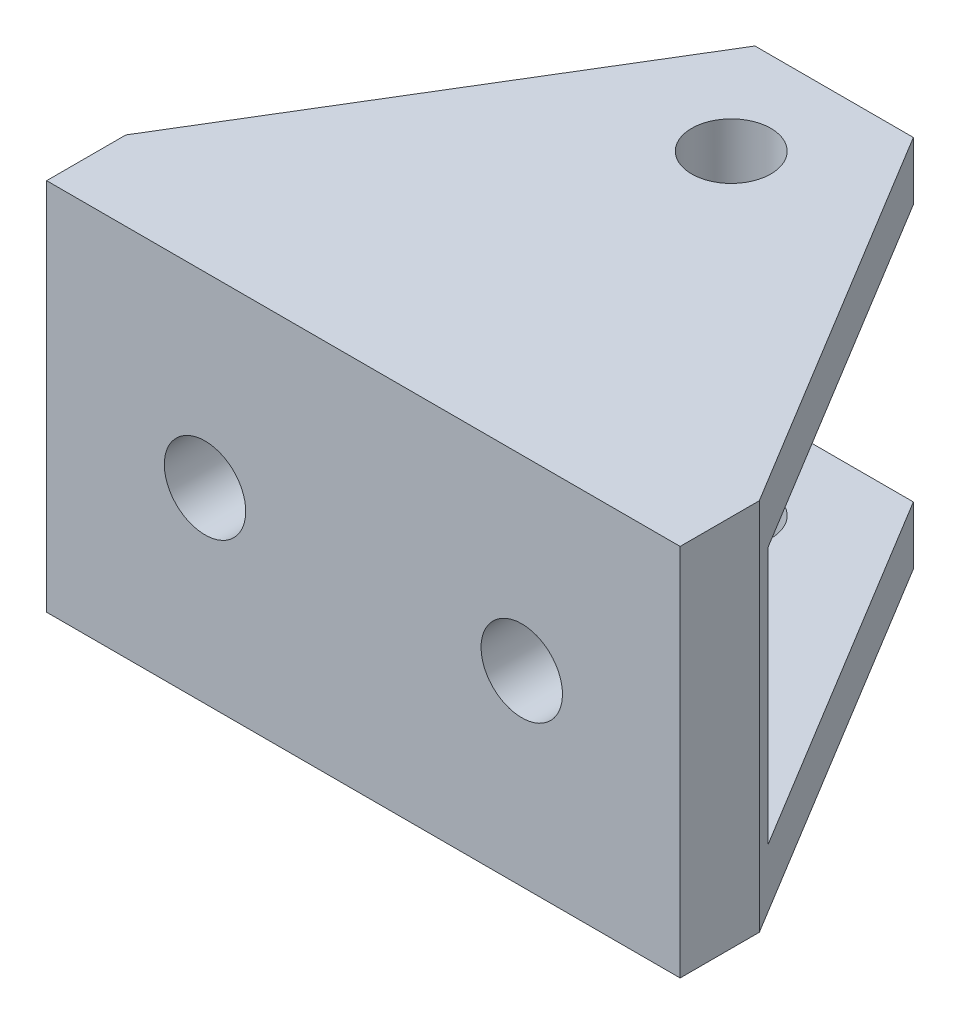
ISO-10303-21;
HEADER;
FILE_DESCRIPTION(('STEP AP214'),'2;1');
FILE_NAME('part.step','',(''),(''),'','','');
FILE_SCHEMA(('AUTOMOTIVE_DESIGN { 1 0 10303 214 1 1 1 1 }'));
ENDSEC;
DATA;
#1=APPLICATION_CONTEXT('core data for automotive mechanical design processes');
#2=APPLICATION_PROTOCOL_DEFINITION('international standard','automotive_design',2000,#1);
#3=PRODUCT_CONTEXT('',#1,'mechanical');
#4=PRODUCT('Part','Part','',(#3));
#5=PRODUCT_RELATED_PRODUCT_CATEGORY('part','',(#4));
#6=PRODUCT_DEFINITION_FORMATION('','',#4);
#7=PRODUCT_DEFINITION_CONTEXT('part definition',#1,'design');
#8=PRODUCT_DEFINITION('design','',#6,#7);
#9=PRODUCT_DEFINITION_SHAPE('','',#8);
#10=(LENGTH_UNIT() NAMED_UNIT(*) SI_UNIT(.MILLI.,.METRE.));
#11=(NAMED_UNIT(*) PLANE_ANGLE_UNIT() SI_UNIT($,.RADIAN.));
#12=(NAMED_UNIT(*) SI_UNIT($,.STERADIAN.) SOLID_ANGLE_UNIT());
#13=UNCERTAINTY_MEASURE_WITH_UNIT(LENGTH_MEASURE(1.E-05),#10,'distance_accuracy_value','');
#14=(GEOMETRIC_REPRESENTATION_CONTEXT(3) GLOBAL_UNCERTAINTY_ASSIGNED_CONTEXT((#13)) GLOBAL_UNIT_ASSIGNED_CONTEXT((#10,
#11,#12)) REPRESENTATION_CONTEXT('',''));
#15=CARTESIAN_POINT('',(0.,0.,0.));
#16=DIRECTION('',(0.,0.,1.));
#17=DIRECTION('',(1.,0.,0.));
#18=AXIS2_PLACEMENT_3D('',#15,#16,#17);
#19=CARTESIAN_POINT('',(50.8,0.,-39.8563150306832));
#20=DIRECTION('',(0.,1.,0.));
#21=DIRECTION('',(0.,0.,1.));
#22=AXIS2_PLACEMENT_3D('',#19,#20,#21);
#23=PLANE('',#22);
#24=CARTESIAN_POINT('',(25.4,0.,-29.4977893685772));
#25=DIRECTION('',(0.,-1.,0.));
#26=DIRECTION('',(0.,0.,-1.));
#27=AXIS2_PLACEMENT_3D('',#24,#25,#26);
#28=CIRCLE('',#27,3.175);
#29=CARTESIAN_POINT('',(25.4,0.,-32.6727893685772));
#30=VERTEX_POINT('',#29);
#31=EDGE_CURVE('E269',#30,#30,#28,.T.);
#32=ORIENTED_EDGE('',*,*,#31,.F.);
#33=EDGE_LOOP('',(#32));
#34=FACE_BOUND('',#33,.T.);
#35=DIRECTION('',(0.,0.,-1.));
#36=VECTOR('',#35,1.);
#37=CARTESIAN_POINT('',(0.,0.,-39.8563150306832));
#38=LINE('',#37,#36);
#39=CARTESIAN_POINT('',(0.,0.,0.));
#40=VERTEX_POINT('',#39);
#41=CARTESIAN_POINT('',(0.,0.,-6.35));
#42=VERTEX_POINT('',#41);
#43=EDGE_CURVE('E149',#40,#42,#38,.T.);
#44=ORIENTED_EDGE('',*,*,#43,.T.);
#45=DIRECTION('',(-0.518660220005768,0.,0.854980453685094));
#46=VECTOR('',#45,1.);
#47=CARTESIAN_POINT('',(0.,0.,-6.35));
#48=LINE('',#47,#46);
#49=CARTESIAN_POINT('',(19.05,0.,-37.7527893685772));
#50=VERTEX_POINT('',#49);
#51=EDGE_CURVE('E70',#50,#42,#48,.T.);
#52=ORIENTED_EDGE('',*,*,#51,.F.);
#53=DIRECTION('',(-1.,0.,0.));
#54=VECTOR('',#53,1.);
#55=CARTESIAN_POINT('',(19.05,0.,-37.7527893685772));
#56=LINE('',#55,#54);
#57=CARTESIAN_POINT('',(31.75,0.,-37.7527893685772));
#58=VERTEX_POINT('',#57);
#59=EDGE_CURVE('E266',#58,#50,#56,.T.);
#60=ORIENTED_EDGE('',*,*,#59,.F.);
#61=DIRECTION('',(-0.518660220005768,0.,-0.854980453685094));
#62=VECTOR('',#61,1.);
#63=CARTESIAN_POINT('',(50.8,0.,-6.35));
#64=LINE('',#63,#62);
#65=CARTESIAN_POINT('',(50.8,0.,-6.35));
#66=VERTEX_POINT('',#65);
#67=EDGE_CURVE('E264',#66,#58,#64,.T.);
#68=ORIENTED_EDGE('',*,*,#67,.F.);
#69=DIRECTION('',(0.,0.,-1.));
#70=VECTOR('',#69,1.);
#71=CARTESIAN_POINT('',(50.8,0.,-39.8563150306832));
#72=LINE('',#71,#70);
#73=CARTESIAN_POINT('',(50.8,0.,0.));
#74=VERTEX_POINT('',#73);
#75=EDGE_CURVE('E153',#74,#66,#72,.T.);
#76=ORIENTED_EDGE('',*,*,#75,.F.);
#77=DIRECTION('',(-1.,0.,0.));
#78=VECTOR('',#77,1.);
#79=CARTESIAN_POINT('',(50.8,0.,0.));
#80=LINE('',#79,#78);
#81=EDGE_CURVE('E159',#74,#40,#80,.T.);
#82=ORIENTED_EDGE('',*,*,#81,.T.);
#83=EDGE_LOOP('',(#44,#52,#60,#68,#76,#82));
#84=FACE_BOUND('',#83,.T.);
#85=ADVANCED_FACE('F47',(#34,#84),#23,.F.);
#86=CARTESIAN_POINT('',(50.8,4.6609,-8.10631503068315));
#87=DIRECTION('',(0.,-1.,0.));
#88=DIRECTION('',(0.,0.,-1.));
#89=AXIS2_PLACEMENT_3D('',#86,#87,#88);
#90=PLANE('',#89);
#91=CARTESIAN_POINT('',(25.4,4.6609,-29.4977893685772));
#92=DIRECTION('',(0.,-1.,0.));
#93=DIRECTION('',(0.,0.,-1.));
#94=AXIS2_PLACEMENT_3D('',#91,#92,#93);
#95=CIRCLE('',#94,3.175);
#96=CARTESIAN_POINT('',(25.4,4.6609,-32.6727893685772));
#97=VERTEX_POINT('',#96);
#98=EDGE_CURVE('E203',#97,#97,#95,.T.);
#99=ORIENTED_EDGE('',*,*,#98,.T.);
#100=EDGE_LOOP('',(#99));
#101=FACE_BOUND('',#100,.T.);
#102=DIRECTION('',(-1.,0.,0.));
#103=VECTOR('',#102,1.);
#104=CARTESIAN_POINT('',(50.8,4.6609,-37.7527893685772));
#105=LINE('',#104,#103);
#106=CARTESIAN_POINT('',(31.75,4.6609,-37.7527893685772));
#107=VERTEX_POINT('',#106);
#108=CARTESIAN_POINT('',(19.05,4.6609,-37.7527893685772));
#109=VERTEX_POINT('',#108);
#110=EDGE_CURVE('E210',#107,#109,#105,.T.);
#111=ORIENTED_EDGE('',*,*,#110,.T.);
#112=DIRECTION('',(-0.518660220005768,0.,0.854980453685094));
#113=VECTOR('',#112,1.);
#114=CARTESIAN_POINT('',(14.4444559074182,4.6609,-30.1608244831682));
#115=LINE('',#114,#113);
#116=CARTESIAN_POINT('',(1.0654404276581,4.66090000000001,-8.10631503068315));
#117=VERTEX_POINT('',#116);
#118=EDGE_CURVE('E182',#109,#117,#115,.T.);
#119=ORIENTED_EDGE('',*,*,#118,.T.);
#120=DIRECTION('',(-1.,0.,0.));
#121=VECTOR('',#120,1.);
#122=CARTESIAN_POINT('',(50.8,4.6609,-8.10631503068315));
#123=LINE('',#122,#121);
#124=CARTESIAN_POINT('',(49.7345595723419,4.6609,-8.10631503068315));
#125=VERTEX_POINT('',#124);
#126=EDGE_CURVE('E11',#125,#117,#123,.T.);
#127=ORIENTED_EDGE('',*,*,#126,.F.);
#128=DIRECTION('',(-0.518660220005768,0.,-0.854980453685094));
#129=VECTOR('',#128,1.);
#130=CARTESIAN_POINT('',(50.0211720224565,4.6609,-7.63385149255397));
#131=LINE('',#130,#129);
#132=EDGE_CURVE('E195',#125,#107,#131,.T.);
#133=ORIENTED_EDGE('',*,*,#132,.T.);
#134=EDGE_LOOP('',(#111,#119,#127,#133));
#135=FACE_BOUND('',#134,.T.);
#136=ADVANCED_FACE('F300',(#101,#135),#90,.F.);
#137=CARTESIAN_POINT('',(50.8,25.3111,-8.10631503068315));
#138=DIRECTION('',(0.,0.,1.));
#139=DIRECTION('',(0.,-1.,0.));
#140=AXIS2_PLACEMENT_3D('',#137,#138,#139);
#141=PLANE('',#140);
#142=CARTESIAN_POINT('',(38.1,14.986,-8.10631503068315));
#143=DIRECTION('',(0.,0.,-1.));
#144=DIRECTION('',(0.,1.,0.));
#145=AXIS2_PLACEMENT_3D('',#142,#143,#144);
#146=CIRCLE('',#145,7.14374999999999);
#147=CARTESIAN_POINT('',(38.1,22.12975,-8.10631503068315));
#148=VERTEX_POINT('',#147);
#149=EDGE_CURVE('E214',#148,#148,#146,.T.);
#150=ORIENTED_EDGE('',*,*,#149,.F.);
#151=EDGE_LOOP('',(#150));
#152=FACE_BOUND('',#151,.T.);
#153=CARTESIAN_POINT('',(12.7,14.986,-8.10631503068315));
#154=DIRECTION('',(0.,0.,-1.));
#155=DIRECTION('',(0.,1.,0.));
#156=AXIS2_PLACEMENT_3D('',#153,#154,#155);
#157=CIRCLE('',#156,7.14374999999999);
#158=CARTESIAN_POINT('',(12.7,22.12975,-8.10631503068315));
#159=VERTEX_POINT('',#158);
#160=EDGE_CURVE('E230',#159,#159,#157,.T.);
#161=ORIENTED_EDGE('',*,*,#160,.F.);
#162=EDGE_LOOP('',(#161));
#163=FACE_BOUND('',#162,.T.);
#164=ORIENTED_EDGE('',*,*,#126,.T.);
#165=DIRECTION('',(0.,1.,0.));
#166=VECTOR('',#165,1.);
#167=CARTESIAN_POINT('',(1.0654404276581,25.3111,-8.10631503068315));
#168=LINE('',#167,#166);
#169=CARTESIAN_POINT('',(1.06544042765809,25.3111,-8.10631503068315));
#170=VERTEX_POINT('',#169);
#171=EDGE_CURVE('E179',#117,#170,#168,.T.);
#172=ORIENTED_EDGE('',*,*,#171,.T.);
#173=DIRECTION('',(-1.,0.,0.));
#174=VECTOR('',#173,1.);
#175=CARTESIAN_POINT('',(50.8,25.3111,-8.10631503068315));
#176=LINE('',#175,#174);
#177=CARTESIAN_POINT('',(49.7345595723419,25.3111,-8.10631503068315));
#178=VERTEX_POINT('',#177);
#179=EDGE_CURVE('E55',#178,#170,#176,.T.);
#180=ORIENTED_EDGE('',*,*,#179,.F.);
#181=DIRECTION('',(0.,-1.,0.));
#182=VECTOR('',#181,1.);
#183=CARTESIAN_POINT('',(49.7345595723419,25.3111,-8.10631503068315));
#184=LINE('',#183,#182);
#185=EDGE_CURVE('E62',#178,#125,#184,.T.);
#186=ORIENTED_EDGE('',*,*,#185,.T.);
#187=EDGE_LOOP('',(#164,#172,#180,#186));
#188=FACE_BOUND('',#187,.T.);
#189=ADVANCED_FACE('F177',(#152,#163,#188),#141,.F.);
#190=CARTESIAN_POINT('',(50.8,25.3111,-39.8563150306832));
#191=DIRECTION('',(0.,1.,0.));
#192=DIRECTION('',(0.,0.,1.));
#193=AXIS2_PLACEMENT_3D('',#190,#191,#192);
#194=PLANE('',#193);
#195=CARTESIAN_POINT('',(25.4,25.3111,-29.4977893685772));
#196=DIRECTION('',(0.,1.,0.));
#197=DIRECTION('',(0.,0.,1.));
#198=AXIS2_PLACEMENT_3D('',#195,#196,#197);
#199=CIRCLE('',#198,3.175);
#200=CARTESIAN_POINT('',(25.4,25.3111,-26.3227893685772));
#201=VERTEX_POINT('',#200);
#202=EDGE_CURVE('E199',#201,#201,#199,.T.);
#203=ORIENTED_EDGE('',*,*,#202,.T.);
#204=EDGE_LOOP('',(#203));
#205=FACE_BOUND('',#204,.T.);
#206=ORIENTED_EDGE('',*,*,#179,.T.);
#207=DIRECTION('',(0.518660220005768,0.,-0.854980453685094));
#208=VECTOR('',#207,1.);
#209=CARTESIAN_POINT('',(28.5238140265521,25.3111,-53.3698070269965));
#210=LINE('',#209,#208);
#211=CARTESIAN_POINT('',(19.05,25.3111,-37.7527893685772));
#212=VERTEX_POINT('',#211);
#213=EDGE_CURVE('E173',#170,#212,#210,.T.);
#214=ORIENTED_EDGE('',*,*,#213,.T.);
#215=DIRECTION('',(1.,0.,0.));
#216=VECTOR('',#215,1.);
#217=CARTESIAN_POINT('',(50.8,25.3111,-37.7527893685772));
#218=LINE('',#217,#216);
#219=CARTESIAN_POINT('',(31.75,25.3111,-37.7527893685772));
#220=VERTEX_POINT('',#219);
#221=EDGE_CURVE('E207',#212,#220,#218,.T.);
#222=ORIENTED_EDGE('',*,*,#221,.T.);
#223=DIRECTION('',(0.518660220005768,0.,0.854980453685094));
#224=VECTOR('',#223,1.);
#225=CARTESIAN_POINT('',(35.9418139033226,25.3111,-30.8428340363823));
#226=LINE('',#225,#224);
#227=EDGE_CURVE('E174',#220,#178,#226,.T.);
#228=ORIENTED_EDGE('',*,*,#227,.T.);
#229=EDGE_LOOP('',(#206,#214,#222,#228));
#230=FACE_BOUND('',#229,.T.);
#231=ADVANCED_FACE('F171',(#205,#230),#194,.F.);
#232=CARTESIAN_POINT('',(50.8,29.972,0.));
#233=DIRECTION('',(0.,-1.,0.));
#234=DIRECTION('',(0.,0.,-1.));
#235=AXIS2_PLACEMENT_3D('',#232,#233,#234);
#236=PLANE('',#235);
#237=CARTESIAN_POINT('',(25.4,29.972,-29.4977893685772));
#238=DIRECTION('',(0.,-1.,0.));
#239=DIRECTION('',(0.,0.,-1.));
#240=AXIS2_PLACEMENT_3D('',#237,#238,#239);
#241=CIRCLE('',#240,3.175);
#242=CARTESIAN_POINT('',(25.4,29.972,-32.6727893685772));
#243=VERTEX_POINT('',#242);
#244=EDGE_CURVE('E187',#243,#243,#241,.F.);
#245=ORIENTED_EDGE('',*,*,#244,.F.);
#246=EDGE_LOOP('',(#245));
#247=FACE_BOUND('',#246,.T.);
#248=DIRECTION('',(1.,0.,0.));
#249=VECTOR('',#248,1.);
#250=CARTESIAN_POINT('',(19.05,29.972,-37.7527893685772));
#251=LINE('',#250,#249);
#252=CARTESIAN_POINT('',(19.05,29.972,-37.7527893685772));
#253=VERTEX_POINT('',#252);
#254=CARTESIAN_POINT('',(31.75,29.972,-37.7527893685772));
#255=VERTEX_POINT('',#254);
#256=EDGE_CURVE('E142',#253,#255,#251,.T.);
#257=ORIENTED_EDGE('',*,*,#256,.F.);
#258=DIRECTION('',(0.518660220005768,0.,-0.854980453685094));
#259=VECTOR('',#258,1.);
#260=CARTESIAN_POINT('',(0.,29.972,-6.35));
#261=LINE('',#260,#259);
#262=CARTESIAN_POINT('',(0.,29.972,-6.35));
#263=VERTEX_POINT('',#262);
#264=EDGE_CURVE('E125',#263,#253,#261,.T.);
#265=ORIENTED_EDGE('',*,*,#264,.F.);
#266=DIRECTION('',(0.,0.,1.));
#267=VECTOR('',#266,1.);
#268=CARTESIAN_POINT('',(0.,29.972,0.));
#269=LINE('',#268,#267);
#270=CARTESIAN_POINT('',(0.,29.972,0.));
#271=VERTEX_POINT('',#270);
#272=EDGE_CURVE('E139',#263,#271,#269,.T.);
#273=ORIENTED_EDGE('',*,*,#272,.T.);
#274=DIRECTION('',(-1.,0.,0.));
#275=VECTOR('',#274,1.);
#276=CARTESIAN_POINT('',(50.8,29.972,0.));
#277=LINE('',#276,#275);
#278=CARTESIAN_POINT('',(50.8,29.972,0.));
#279=VERTEX_POINT('',#278);
#280=EDGE_CURVE('E163',#279,#271,#277,.T.);
#281=ORIENTED_EDGE('',*,*,#280,.F.);
#282=DIRECTION('',(0.,0.,1.));
#283=VECTOR('',#282,1.);
#284=CARTESIAN_POINT('',(50.8,29.972,0.));
#285=LINE('',#284,#283);
#286=CARTESIAN_POINT('',(50.8,29.972,-6.35000000000001));
#287=VERTEX_POINT('',#286);
#288=EDGE_CURVE('E248',#287,#279,#285,.T.);
#289=ORIENTED_EDGE('',*,*,#288,.F.);
#290=DIRECTION('',(0.518660220005768,0.,0.854980453685094));
#291=VECTOR('',#290,1.);
#292=CARTESIAN_POINT('',(50.8,29.972,-6.35));
#293=LINE('',#292,#291);
#294=EDGE_CURVE('E133',#255,#287,#293,.T.);
#295=ORIENTED_EDGE('',*,*,#294,.F.);
#296=EDGE_LOOP('',(#257,#265,#273,#281,#289,#295));
#297=FACE_BOUND('',#296,.T.);
#298=ADVANCED_FACE('F137',(#247,#297),#236,.F.);
#299=CARTESIAN_POINT('',(50.8,0.,0.));
#300=DIRECTION('',(0.,0.,-1.));
#301=DIRECTION('',(-1.,0.,0.));
#302=AXIS2_PLACEMENT_3D('',#299,#300,#301);
#303=PLANE('',#302);
#304=CARTESIAN_POINT('',(38.1,14.986,0.));
#305=DIRECTION('',(0.,0.,-1.));
#306=DIRECTION('',(0.,1.,0.));
#307=AXIS2_PLACEMENT_3D('',#304,#305,#306);
#308=CIRCLE('',#307,3.2639);
#309=CARTESIAN_POINT('',(38.1,18.2499,0.));
#310=VERTEX_POINT('',#309);
#311=EDGE_CURVE('E226',#310,#310,#308,.T.);
#312=ORIENTED_EDGE('',*,*,#311,.T.);
#313=EDGE_LOOP('',(#312));
#314=FACE_BOUND('',#313,.T.);
#315=CARTESIAN_POINT('',(12.7,14.986,0.));
#316=DIRECTION('',(0.,0.,-1.));
#317=DIRECTION('',(0.,1.,0.));
#318=AXIS2_PLACEMENT_3D('',#315,#316,#317);
#319=CIRCLE('',#318,3.2639);
#320=CARTESIAN_POINT('',(12.7,18.2499,0.));
#321=VERTEX_POINT('',#320);
#322=EDGE_CURVE('E155',#321,#321,#319,.T.);
#323=ORIENTED_EDGE('',*,*,#322,.T.);
#324=EDGE_LOOP('',(#323));
#325=FACE_BOUND('',#324,.T.);
#326=DIRECTION('',(0.,-1.,0.));
#327=VECTOR('',#326,1.);
#328=CARTESIAN_POINT('',(0.,0.,0.));
#329=LINE('',#328,#327);
#330=EDGE_CURVE('E147',#271,#40,#329,.T.);
#331=ORIENTED_EDGE('',*,*,#330,.T.);
#332=ORIENTED_EDGE('',*,*,#81,.F.);
#333=DIRECTION('',(0.,-1.,0.));
#334=VECTOR('',#333,1.);
#335=CARTESIAN_POINT('',(50.8,0.,0.));
#336=LINE('',#335,#334);
#337=EDGE_CURVE('E164',#279,#74,#336,.T.);
#338=ORIENTED_EDGE('',*,*,#337,.F.);
#339=ORIENTED_EDGE('',*,*,#280,.T.);
#340=EDGE_LOOP('',(#331,#332,#338,#339));
#341=FACE_BOUND('',#340,.T.);
#342=ADVANCED_FACE('F259',(#314,#325,#341),#303,.F.);
#343=CARTESIAN_POINT('',(50.8,0.,0.));
#344=DIRECTION('',(-1.,0.,0.));
#345=DIRECTION('',(0.,0.,1.));
#346=AXIS2_PLACEMENT_3D('',#343,#344,#345);
#347=PLANE('',#346);
#348=ORIENTED_EDGE('',*,*,#75,.T.);
#349=DIRECTION('',(0.,-1.,0.));
#350=VECTOR('',#349,1.);
#351=CARTESIAN_POINT('',(50.8,90.8268531091431,-6.35));
#352=LINE('',#351,#350);
#353=EDGE_CURVE('E327',#287,#66,#352,.T.);
#354=ORIENTED_EDGE('',*,*,#353,.F.);
#355=ORIENTED_EDGE('',*,*,#288,.T.);
#356=ORIENTED_EDGE('',*,*,#337,.T.);
#357=EDGE_LOOP('',(#348,#354,#355,#356));
#358=FACE_BOUND('',#357,.T.);
#359=ADVANCED_FACE('F254',(#358),#347,.F.);
#360=CARTESIAN_POINT('',(0.,0.,0.));
#361=DIRECTION('',(-1.,0.,0.));
#362=DIRECTION('',(0.,0.,1.));
#363=AXIS2_PLACEMENT_3D('',#360,#361,#362);
#364=PLANE('',#363);
#365=DIRECTION('',(0.,-1.,0.));
#366=VECTOR('',#365,1.);
#367=CARTESIAN_POINT('',(0.,90.8268531091431,-6.35));
#368=LINE('',#367,#366);
#369=EDGE_CURVE('E121',#263,#42,#368,.T.);
#370=ORIENTED_EDGE('',*,*,#369,.T.);
#371=ORIENTED_EDGE('',*,*,#43,.F.);
#372=ORIENTED_EDGE('',*,*,#330,.F.);
#373=ORIENTED_EDGE('',*,*,#272,.F.);
#374=EDGE_LOOP('',(#370,#371,#372,#373));
#375=FACE_BOUND('',#374,.T.);
#376=ADVANCED_FACE('F146',(#375),#364,.T.);
#377=CARTESIAN_POINT('',(12.7,14.986,-8.10631503068315));
#378=DIRECTION('',(0.,0.,-1.));
#379=DIRECTION('',(0.,1.,0.));
#380=AXIS2_PLACEMENT_3D('',#377,#378,#379);
#381=CYLINDRICAL_SURFACE('',#380,3.2639);
#382=ORIENTED_EDGE('',*,*,#322,.F.);
#383=EDGE_LOOP('',(#382));
#384=FACE_BOUND('',#383,.T.);
#385=CARTESIAN_POINT('',(12.7,14.986,-4.80431503068315));
#386=DIRECTION('',(0.,0.,-1.));
#387=DIRECTION('',(0.,1.,0.));
#388=AXIS2_PLACEMENT_3D('',#385,#386,#387);
#389=CIRCLE('',#388,3.26390000000001);
#390=CARTESIAN_POINT('',(12.7,18.2499,-4.80431503068315));
#391=VERTEX_POINT('',#390);
#392=EDGE_CURVE('E238',#391,#391,#389,.T.);
#393=ORIENTED_EDGE('',*,*,#392,.T.);
#394=EDGE_LOOP('',(#393));
#395=FACE_BOUND('',#394,.T.);
#396=ADVANCED_FACE('F363',(#384,#395),#381,.F.);
#397=CARTESIAN_POINT('',(15.9639,14.986,-4.80431503068315));
#398=DIRECTION('',(0.,0.,1.));
#399=DIRECTION('',(0.,-1.,0.));
#400=AXIS2_PLACEMENT_3D('',#397,#398,#399);
#401=PLANE('',#400);
#402=ORIENTED_EDGE('',*,*,#392,.F.);
#403=EDGE_LOOP('',(#402));
#404=FACE_BOUND('',#403,.T.);
#405=CARTESIAN_POINT('',(12.7,14.986,-4.80431503068315));
#406=DIRECTION('',(0.,0.,-1.));
#407=DIRECTION('',(0.,1.,0.));
#408=AXIS2_PLACEMENT_3D('',#405,#406,#407);
#409=CIRCLE('',#408,7.14374999999999);
#410=CARTESIAN_POINT('',(12.7,22.12975,-4.80431503068315));
#411=VERTEX_POINT('',#410);
#412=EDGE_CURVE('E234',#411,#411,#409,.T.);
#413=ORIENTED_EDGE('',*,*,#412,.T.);
#414=EDGE_LOOP('',(#413));
#415=FACE_BOUND('',#414,.T.);
#416=ADVANCED_FACE('F359',(#404,#415),#401,.F.);
#417=CARTESIAN_POINT('',(12.7,14.986,-8.10631503068315));
#418=DIRECTION('',(0.,0.,-1.));
#419=DIRECTION('',(0.,1.,0.));
#420=AXIS2_PLACEMENT_3D('',#417,#418,#419);
#421=CYLINDRICAL_SURFACE('',#420,7.14374999999999);
#422=ORIENTED_EDGE('',*,*,#412,.F.);
#423=EDGE_LOOP('',(#422));
#424=FACE_BOUND('',#423,.T.);
#425=ORIENTED_EDGE('',*,*,#160,.T.);
#426=EDGE_LOOP('',(#425));
#427=FACE_BOUND('',#426,.T.);
#428=ADVANCED_FACE('F355',(#424,#427),#421,.F.);
#429=CARTESIAN_POINT('',(38.1,14.986,-8.10631503068315));
#430=DIRECTION('',(0.,0.,-1.));
#431=DIRECTION('',(0.,1.,0.));
#432=AXIS2_PLACEMENT_3D('',#429,#430,#431);
#433=CYLINDRICAL_SURFACE('',#432,3.26390000000001);
#434=ORIENTED_EDGE('',*,*,#311,.F.);
#435=EDGE_LOOP('',(#434));
#436=FACE_BOUND('',#435,.T.);
#437=CARTESIAN_POINT('',(38.1,14.986,-4.80431503068315));
#438=DIRECTION('',(0.,0.,-1.));
#439=DIRECTION('',(0.,1.,0.));
#440=AXIS2_PLACEMENT_3D('',#437,#438,#439);
#441=CIRCLE('',#440,3.26390000000001);
#442=CARTESIAN_POINT('',(38.1,18.2499,-4.80431503068315));
#443=VERTEX_POINT('',#442);
#444=EDGE_CURVE('E222',#443,#443,#441,.T.);
#445=ORIENTED_EDGE('',*,*,#444,.T.);
#446=EDGE_LOOP('',(#445));
#447=FACE_BOUND('',#446,.T.);
#448=ADVANCED_FACE('F351',(#436,#447),#433,.F.);
#449=CARTESIAN_POINT('',(41.3639,14.986,-4.80431503068315));
#450=DIRECTION('',(0.,0.,1.));
#451=DIRECTION('',(0.,-1.,0.));
#452=AXIS2_PLACEMENT_3D('',#449,#450,#451);
#453=PLANE('',#452);
#454=ORIENTED_EDGE('',*,*,#444,.F.);
#455=EDGE_LOOP('',(#454));
#456=FACE_BOUND('',#455,.T.);
#457=CARTESIAN_POINT('',(38.1,14.986,-4.80431503068315));
#458=DIRECTION('',(0.,0.,-1.));
#459=DIRECTION('',(0.,1.,0.));
#460=AXIS2_PLACEMENT_3D('',#457,#458,#459);
#461=CIRCLE('',#460,7.14374999999999);
#462=CARTESIAN_POINT('',(38.1,22.12975,-4.80431503068315));
#463=VERTEX_POINT('',#462);
#464=EDGE_CURVE('E218',#463,#463,#461,.T.);
#465=ORIENTED_EDGE('',*,*,#464,.T.);
#466=EDGE_LOOP('',(#465));
#467=FACE_BOUND('',#466,.T.);
#468=ADVANCED_FACE('F347',(#456,#467),#453,.F.);
#469=CARTESIAN_POINT('',(38.1,14.986,-8.10631503068315));
#470=DIRECTION('',(0.,0.,-1.));
#471=DIRECTION('',(0.,1.,0.));
#472=AXIS2_PLACEMENT_3D('',#469,#470,#471);
#473=CYLINDRICAL_SURFACE('',#472,7.14374999999999);
#474=ORIENTED_EDGE('',*,*,#464,.F.);
#475=EDGE_LOOP('',(#474));
#476=FACE_BOUND('',#475,.T.);
#477=ORIENTED_EDGE('',*,*,#149,.T.);
#478=EDGE_LOOP('',(#477));
#479=FACE_BOUND('',#478,.T.);
#480=ADVANCED_FACE('F342',(#476,#479),#473,.F.);
#481=CARTESIAN_POINT('',(19.05,90.8268531091431,-37.7527893685772));
#482=DIRECTION('',(0.,0.,1.));
#483=DIRECTION('',(1.,0.,0.));
#484=AXIS2_PLACEMENT_3D('',#481,#482,#483);
#485=PLANE('',#484);
#486=DIRECTION('',(0.,-1.,0.));
#487=VECTOR('',#486,1.);
#488=CARTESIAN_POINT('',(31.75,90.8268531091431,-37.7527893685772));
#489=LINE('',#488,#487);
#490=EDGE_CURVE('E318',#107,#58,#489,.T.);
#491=ORIENTED_EDGE('',*,*,#490,.T.);
#492=ORIENTED_EDGE('',*,*,#59,.T.);
#493=DIRECTION('',(0.,-1.,0.));
#494=VECTOR('',#493,1.);
#495=CARTESIAN_POINT('',(19.05,90.8268531091431,-37.7527893685772));
#496=LINE('',#495,#494);
#497=EDGE_CURVE('E132',#109,#50,#496,.T.);
#498=ORIENTED_EDGE('',*,*,#497,.F.);
#499=ORIENTED_EDGE('',*,*,#110,.F.);
#500=EDGE_LOOP('',(#491,#492,#498,#499));
#501=FACE_BOUND('',#500,.T.);
#502=ADVANCED_FACE('F317',(#501),#485,.F.);
#503=EDGE_CURVE('E322',#253,#212,#496,.T.);
#504=ORIENTED_EDGE('',*,*,#503,.F.);
#505=ORIENTED_EDGE('',*,*,#256,.T.);
#506=EDGE_CURVE('E321',#255,#220,#489,.T.);
#507=ORIENTED_EDGE('',*,*,#506,.T.);
#508=ORIENTED_EDGE('',*,*,#221,.F.);
#509=EDGE_LOOP('',(#504,#505,#507,#508));
#510=FACE_BOUND('',#509,.T.);
#511=ADVANCED_FACE('F334',(#510),#485,.F.);
#512=CARTESIAN_POINT('',(50.8,90.8268531091431,-6.35));
#513=DIRECTION('',(-0.854980453685094,0.,0.518660220005768));
#514=DIRECTION('',(0.518660220005768,0.,0.854980453685094));
#515=AXIS2_PLACEMENT_3D('',#512,#513,#514);
#516=PLANE('',#515);
#517=ORIENTED_EDGE('',*,*,#185,.F.);
#518=ORIENTED_EDGE('',*,*,#227,.F.);
#519=ORIENTED_EDGE('',*,*,#506,.F.);
#520=ORIENTED_EDGE('',*,*,#294,.T.);
#521=ORIENTED_EDGE('',*,*,#353,.T.);
#522=ORIENTED_EDGE('',*,*,#67,.T.);
#523=ORIENTED_EDGE('',*,*,#490,.F.);
#524=ORIENTED_EDGE('',*,*,#132,.F.);
#525=EDGE_LOOP('',(#517,#518,#519,#520,#521,#522,#523,#524));
#526=FACE_BOUND('',#525,.T.);
#527=ADVANCED_FACE('F319',(#526),#516,.F.);
#528=CARTESIAN_POINT('',(0.,90.8268531091431,-6.35));
#529=DIRECTION('',(0.854980453685094,0.,0.518660220005768));
#530=DIRECTION('',(0.518660220005768,0.,-0.854980453685094));
#531=AXIS2_PLACEMENT_3D('',#528,#529,#530);
#532=PLANE('',#531);
#533=ORIENTED_EDGE('',*,*,#497,.T.);
#534=ORIENTED_EDGE('',*,*,#51,.T.);
#535=ORIENTED_EDGE('',*,*,#369,.F.);
#536=ORIENTED_EDGE('',*,*,#264,.T.);
#537=ORIENTED_EDGE('',*,*,#503,.T.);
#538=ORIENTED_EDGE('',*,*,#213,.F.);
#539=ORIENTED_EDGE('',*,*,#171,.F.);
#540=ORIENTED_EDGE('',*,*,#118,.F.);
#541=EDGE_LOOP('',(#533,#534,#535,#536,#537,#538,#539,#540));
#542=FACE_BOUND('',#541,.T.);
#543=ADVANCED_FACE('F123',(#542),#532,.F.);
#544=CARTESIAN_POINT('',(25.4,90.8268531091431,-29.4977893685772));
#545=DIRECTION('',(0.,-1.,0.));
#546=DIRECTION('',(0.,0.,-1.));
#547=AXIS2_PLACEMENT_3D('',#544,#545,#546);
#548=CYLINDRICAL_SURFACE('',#547,3.175);
#549=ORIENTED_EDGE('',*,*,#244,.T.);
#550=EDGE_LOOP('',(#549));
#551=FACE_BOUND('',#550,.T.);
#552=ORIENTED_EDGE('',*,*,#202,.F.);
#553=EDGE_LOOP('',(#552));
#554=FACE_BOUND('',#553,.T.);
#555=ADVANCED_FACE('F285',(#551,#554),#548,.F.);
#556=ORIENTED_EDGE('',*,*,#31,.T.);
#557=EDGE_LOOP('',(#556));
#558=FACE_BOUND('',#557,.T.);
#559=ORIENTED_EDGE('',*,*,#98,.F.);
#560=EDGE_LOOP('',(#559));
#561=FACE_BOUND('',#560,.T.);
#562=ADVANCED_FACE('F309',(#558,#561),#548,.F.);
#563=CLOSED_SHELL('',(#85,#136,#189,#231,#298,#342,#359,#376,#396,#416,#428,#448,#468,#480,#502,
#511,#527,#543,#555,#562));
#564=MANIFOLD_SOLID_BREP('B2',#563);
#565=ADVANCED_BREP_SHAPE_REPRESENTATION('',(#18,#564),#14);
#566=SHAPE_DEFINITION_REPRESENTATION(#9,#565);
ENDSEC;
END-ISO-10303-21;
